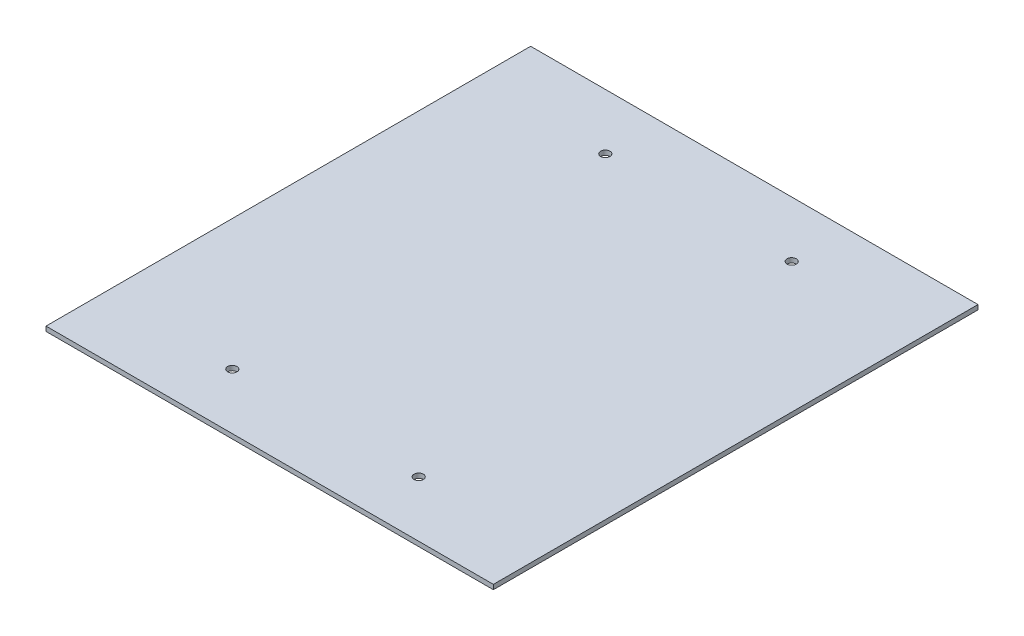
ISO-10303-21;
HEADER;
FILE_DESCRIPTION(('STEP AP214'),'2;1');
FILE_NAME('part.step','',(''),(''),'','','');
FILE_SCHEMA(('AUTOMOTIVE_DESIGN { 1 0 10303 214 1 1 1 1 }'));
ENDSEC;
DATA;
#1=APPLICATION_CONTEXT('core data for automotive mechanical design processes');
#2=APPLICATION_PROTOCOL_DEFINITION('international standard','automotive_design',2000,#1);
#3=PRODUCT_CONTEXT('',#1,'mechanical');
#4=PRODUCT('Part','Part','',(#3));
#5=PRODUCT_RELATED_PRODUCT_CATEGORY('part','',(#4));
#6=PRODUCT_DEFINITION_FORMATION('','',#4);
#7=PRODUCT_DEFINITION_CONTEXT('part definition',#1,'design');
#8=PRODUCT_DEFINITION('design','',#6,#7);
#9=PRODUCT_DEFINITION_SHAPE('','',#8);
#10=(LENGTH_UNIT() NAMED_UNIT(*) SI_UNIT(.MILLI.,.METRE.));
#11=(NAMED_UNIT(*) PLANE_ANGLE_UNIT() SI_UNIT($,.RADIAN.));
#12=(NAMED_UNIT(*) SI_UNIT($,.STERADIAN.) SOLID_ANGLE_UNIT());
#13=UNCERTAINTY_MEASURE_WITH_UNIT(LENGTH_MEASURE(1.E-05),#10,'distance_accuracy_value','');
#14=(GEOMETRIC_REPRESENTATION_CONTEXT(3) GLOBAL_UNCERTAINTY_ASSIGNED_CONTEXT((#13)) GLOBAL_UNIT_ASSIGNED_CONTEXT((#10,
#11,#12)) REPRESENTATION_CONTEXT('',''));
#15=CARTESIAN_POINT('',(0.,0.,0.));
#16=DIRECTION('',(0.,0.,1.));
#17=DIRECTION('',(1.,0.,0.));
#18=AXIS2_PLACEMENT_3D('',#15,#16,#17);
#19=CARTESIAN_POINT('',(152.4,-3.175,165.1));
#20=DIRECTION('',(1.,0.,0.));
#21=DIRECTION('',(0.,0.,-1.));
#22=AXIS2_PLACEMENT_3D('',#19,#20,#21);
#23=PLANE('',#22);
#24=DIRECTION('',(0.,0.,-1.));
#25=VECTOR('',#24,1.);
#26=CARTESIAN_POINT('',(152.4,0.,165.1));
#27=LINE('',#26,#25);
#28=CARTESIAN_POINT('',(152.4,0.,165.1));
#29=VERTEX_POINT('',#28);
#30=CARTESIAN_POINT('',(152.4,0.,-165.1));
#31=VERTEX_POINT('',#30);
#32=EDGE_CURVE('E118',#29,#31,#27,.T.);
#33=ORIENTED_EDGE('',*,*,#32,.F.);
#34=DIRECTION('',(0.,1.,0.));
#35=VECTOR('',#34,1.);
#36=CARTESIAN_POINT('',(152.4,-3.175,165.1));
#37=LINE('',#36,#35);
#38=CARTESIAN_POINT('',(152.4,-3.175,165.1));
#39=VERTEX_POINT('',#38);
#40=EDGE_CURVE('E11',#39,#29,#37,.T.);
#41=ORIENTED_EDGE('',*,*,#40,.F.);
#42=DIRECTION('',(0.,0.,-1.));
#43=VECTOR('',#42,1.);
#44=CARTESIAN_POINT('',(152.4,-3.175,165.1));
#45=LINE('',#44,#43);
#46=CARTESIAN_POINT('',(152.4,-3.175,-165.1));
#47=VERTEX_POINT('',#46);
#48=EDGE_CURVE('E109',#39,#47,#45,.T.);
#49=ORIENTED_EDGE('',*,*,#48,.T.);
#50=DIRECTION('',(0.,1.,0.));
#51=VECTOR('',#50,1.);
#52=CARTESIAN_POINT('',(152.4,-3.175,-165.1));
#53=LINE('',#52,#51);
#54=EDGE_CURVE('E50',#47,#31,#53,.T.);
#55=ORIENTED_EDGE('',*,*,#54,.T.);
#56=EDGE_LOOP('',(#33,#41,#49,#55));
#57=FACE_BOUND('',#56,.T.);
#58=ADVANCED_FACE('F47',(#57),#23,.T.);
#59=CARTESIAN_POINT('',(-152.4,-3.175,165.1));
#60=DIRECTION('',(0.,0.,1.));
#61=DIRECTION('',(1.,0.,0.));
#62=AXIS2_PLACEMENT_3D('',#59,#60,#61);
#63=PLANE('',#62);
#64=DIRECTION('',(1.,0.,0.));
#65=VECTOR('',#64,1.);
#66=CARTESIAN_POINT('',(-152.4,0.,165.1));
#67=LINE('',#66,#65);
#68=CARTESIAN_POINT('',(-152.4,0.,165.1));
#69=VERTEX_POINT('',#68);
#70=EDGE_CURVE('E112',#69,#29,#67,.T.);
#71=ORIENTED_EDGE('',*,*,#70,.F.);
#72=DIRECTION('',(0.,1.,0.));
#73=VECTOR('',#72,1.);
#74=CARTESIAN_POINT('',(-152.4,-3.175,165.1));
#75=LINE('',#74,#73);
#76=CARTESIAN_POINT('',(-152.4,-3.175,165.1));
#77=VERTEX_POINT('',#76);
#78=EDGE_CURVE('E57',#77,#69,#75,.T.);
#79=ORIENTED_EDGE('',*,*,#78,.F.);
#80=DIRECTION('',(1.,0.,0.));
#81=VECTOR('',#80,1.);
#82=CARTESIAN_POINT('',(-152.4,-3.175,165.1));
#83=LINE('',#82,#81);
#84=EDGE_CURVE('E104',#77,#39,#83,.T.);
#85=ORIENTED_EDGE('',*,*,#84,.T.);
#86=ORIENTED_EDGE('',*,*,#40,.T.);
#87=EDGE_LOOP('',(#71,#79,#85,#86));
#88=FACE_BOUND('',#87,.T.);
#89=ADVANCED_FACE('F135',(#88),#63,.T.);
#90=CARTESIAN_POINT('',(-152.4,-3.175,165.1));
#91=DIRECTION('',(-1.,0.,0.));
#92=DIRECTION('',(0.,0.,1.));
#93=AXIS2_PLACEMENT_3D('',#90,#91,#92);
#94=PLANE('',#93);
#95=DIRECTION('',(0.,0.,1.));
#96=VECTOR('',#95,1.);
#97=CARTESIAN_POINT('',(-152.4,0.,165.1));
#98=LINE('',#97,#96);
#99=CARTESIAN_POINT('',(-152.4,0.,-165.1));
#100=VERTEX_POINT('',#99);
#101=EDGE_CURVE('E98',#100,#69,#98,.T.);
#102=ORIENTED_EDGE('',*,*,#101,.F.);
#103=DIRECTION('',(0.,1.,0.));
#104=VECTOR('',#103,1.);
#105=CARTESIAN_POINT('',(-152.4,-3.175,-165.1));
#106=LINE('',#105,#104);
#107=CARTESIAN_POINT('',(-152.4,-3.175,-165.1));
#108=VERTEX_POINT('',#107);
#109=EDGE_CURVE('E93',#108,#100,#106,.T.);
#110=ORIENTED_EDGE('',*,*,#109,.F.);
#111=DIRECTION('',(0.,0.,1.));
#112=VECTOR('',#111,1.);
#113=CARTESIAN_POINT('',(-152.4,-3.175,165.1));
#114=LINE('',#113,#112);
#115=EDGE_CURVE('E96',#108,#77,#114,.T.);
#116=ORIENTED_EDGE('',*,*,#115,.T.);
#117=ORIENTED_EDGE('',*,*,#78,.T.);
#118=EDGE_LOOP('',(#102,#110,#116,#117));
#119=FACE_BOUND('',#118,.T.);
#120=ADVANCED_FACE('F95',(#119),#94,.T.);
#121=CARTESIAN_POINT('',(-152.4,-3.175,-165.1));
#122=DIRECTION('',(0.,0.,-1.));
#123=DIRECTION('',(-1.,0.,0.));
#124=AXIS2_PLACEMENT_3D('',#121,#122,#123);
#125=PLANE('',#124);
#126=DIRECTION('',(-1.,0.,0.));
#127=VECTOR('',#126,1.);
#128=CARTESIAN_POINT('',(-152.4,0.,-165.1));
#129=LINE('',#128,#127);
#130=EDGE_CURVE('E122',#31,#100,#129,.T.);
#131=ORIENTED_EDGE('',*,*,#130,.F.);
#132=ORIENTED_EDGE('',*,*,#54,.F.);
#133=DIRECTION('',(-1.,0.,0.));
#134=VECTOR('',#133,1.);
#135=CARTESIAN_POINT('',(-152.4,-3.175,-165.1));
#136=LINE('',#135,#134);
#137=EDGE_CURVE('E103',#47,#108,#136,.T.);
#138=ORIENTED_EDGE('',*,*,#137,.T.);
#139=ORIENTED_EDGE('',*,*,#109,.T.);
#140=EDGE_LOOP('',(#131,#132,#138,#139));
#141=FACE_BOUND('',#140,.T.);
#142=ADVANCED_FACE('F107',(#141),#125,.T.);
#143=CARTESIAN_POINT('',(0.,-3.175,0.));
#144=DIRECTION('',(0.,-1.,0.));
#145=DIRECTION('',(0.,0.,-1.));
#146=AXIS2_PLACEMENT_3D('',#143,#144,#145);
#147=PLANE('',#146);
#148=CARTESIAN_POINT('',(-63.5,-3.175,127.06));
#149=DIRECTION('',(0.,1.,0.));
#150=DIRECTION('',(0.,0.,1.));
#151=AXIS2_PLACEMENT_3D('',#148,#149,#150);
#152=CIRCLE('',#151,3.175);
#153=CARTESIAN_POINT('',(-63.5,-3.175,130.235));
#154=VERTEX_POINT('',#153);
#155=EDGE_CURVE('E202',#154,#154,#152,.T.);
#156=ORIENTED_EDGE('',*,*,#155,.T.);
#157=EDGE_LOOP('',(#156));
#158=FACE_BOUND('',#157,.T.);
#159=CARTESIAN_POINT('',(63.5,-3.175,127.06));
#160=DIRECTION('',(0.,1.,0.));
#161=DIRECTION('',(0.,0.,1.));
#162=AXIS2_PLACEMENT_3D('',#159,#160,#161);
#163=CIRCLE('',#162,3.175);
#164=CARTESIAN_POINT('',(63.5,-3.175,130.235));
#165=VERTEX_POINT('',#164);
#166=EDGE_CURVE('E194',#165,#165,#163,.T.);
#167=ORIENTED_EDGE('',*,*,#166,.T.);
#168=EDGE_LOOP('',(#167));
#169=FACE_BOUND('',#168,.T.);
#170=CARTESIAN_POINT('',(63.5,-3.175,-127.06));
#171=DIRECTION('',(0.,1.,0.));
#172=DIRECTION('',(0.,0.,1.));
#173=AXIS2_PLACEMENT_3D('',#170,#171,#172);
#174=CIRCLE('',#173,3.175);
#175=CARTESIAN_POINT('',(63.5,-3.175,-123.885));
#176=VERTEX_POINT('',#175);
#177=EDGE_CURVE('E177',#176,#176,#174,.T.);
#178=ORIENTED_EDGE('',*,*,#177,.T.);
#179=EDGE_LOOP('',(#178));
#180=FACE_BOUND('',#179,.T.);
#181=CARTESIAN_POINT('',(-63.5,-3.175,-127.06));
#182=DIRECTION('',(0.,1.,0.));
#183=DIRECTION('',(0.,0.,1.));
#184=AXIS2_PLACEMENT_3D('',#181,#182,#183);
#185=CIRCLE('',#184,3.175);
#186=CARTESIAN_POINT('',(-63.5,-3.175,-123.885));
#187=VERTEX_POINT('',#186);
#188=EDGE_CURVE('E123',#187,#187,#185,.T.);
#189=ORIENTED_EDGE('',*,*,#188,.T.);
#190=EDGE_LOOP('',(#189));
#191=FACE_BOUND('',#190,.T.);
#192=ORIENTED_EDGE('',*,*,#48,.F.);
#193=ORIENTED_EDGE('',*,*,#84,.F.);
#194=ORIENTED_EDGE('',*,*,#115,.F.);
#195=ORIENTED_EDGE('',*,*,#137,.F.);
#196=EDGE_LOOP('',(#192,#193,#194,#195));
#197=FACE_BOUND('',#196,.T.);
#198=ADVANCED_FACE('F102',(#158,#169,#180,#191,#197),#147,.T.);
#199=CARTESIAN_POINT('',(0.,0.,0.));
#200=DIRECTION('',(0.,-1.,0.));
#201=DIRECTION('',(0.,0.,-1.));
#202=AXIS2_PLACEMENT_3D('',#199,#200,#201);
#203=PLANE('',#202);
#204=CARTESIAN_POINT('',(-63.5,0.,127.06));
#205=DIRECTION('',(0.,1.,0.));
#206=DIRECTION('',(0.,0.,1.));
#207=AXIS2_PLACEMENT_3D('',#204,#205,#206);
#208=CIRCLE('',#207,3.175);
#209=CARTESIAN_POINT('',(-63.5,0.,130.235));
#210=VERTEX_POINT('',#209);
#211=EDGE_CURVE('E198',#210,#210,#208,.T.);
#212=ORIENTED_EDGE('',*,*,#211,.F.);
#213=EDGE_LOOP('',(#212));
#214=FACE_BOUND('',#213,.T.);
#215=CARTESIAN_POINT('',(63.5,0.,127.06));
#216=DIRECTION('',(0.,1.,0.));
#217=DIRECTION('',(0.,0.,1.));
#218=AXIS2_PLACEMENT_3D('',#215,#216,#217);
#219=CIRCLE('',#218,3.175);
#220=CARTESIAN_POINT('',(63.5,0.,130.235));
#221=VERTEX_POINT('',#220);
#222=EDGE_CURVE('E188',#221,#221,#219,.T.);
#223=ORIENTED_EDGE('',*,*,#222,.F.);
#224=EDGE_LOOP('',(#223));
#225=FACE_BOUND('',#224,.T.);
#226=CARTESIAN_POINT('',(63.5,0.,-127.06));
#227=DIRECTION('',(0.,1.,0.));
#228=DIRECTION('',(0.,0.,1.));
#229=AXIS2_PLACEMENT_3D('',#226,#227,#228);
#230=CIRCLE('',#229,3.175);
#231=CARTESIAN_POINT('',(63.5,0.,-123.885));
#232=VERTEX_POINT('',#231);
#233=EDGE_CURVE('E180',#232,#232,#230,.T.);
#234=ORIENTED_EDGE('',*,*,#233,.F.);
#235=EDGE_LOOP('',(#234));
#236=FACE_BOUND('',#235,.T.);
#237=CARTESIAN_POINT('',(-63.5,0.,-127.06));
#238=DIRECTION('',(0.,1.,0.));
#239=DIRECTION('',(0.,0.,1.));
#240=AXIS2_PLACEMENT_3D('',#237,#238,#239);
#241=CIRCLE('',#240,3.175);
#242=CARTESIAN_POINT('',(-63.5,0.,-123.885));
#243=VERTEX_POINT('',#242);
#244=EDGE_CURVE('E183',#243,#243,#241,.T.);
#245=ORIENTED_EDGE('',*,*,#244,.F.);
#246=EDGE_LOOP('',(#245));
#247=FACE_BOUND('',#246,.T.);
#248=ORIENTED_EDGE('',*,*,#32,.T.);
#249=ORIENTED_EDGE('',*,*,#130,.T.);
#250=ORIENTED_EDGE('',*,*,#101,.T.);
#251=ORIENTED_EDGE('',*,*,#70,.T.);
#252=EDGE_LOOP('',(#248,#249,#250,#251));
#253=FACE_BOUND('',#252,.T.);
#254=ADVANCED_FACE('F134',(#214,#225,#236,#247,#253),#203,.F.);
#255=CARTESIAN_POINT('',(-63.5,-3.175,-127.06));
#256=DIRECTION('',(0.,1.,0.));
#257=DIRECTION('',(0.,0.,1.));
#258=AXIS2_PLACEMENT_3D('',#255,#256,#257);
#259=CYLINDRICAL_SURFACE('',#258,3.175);
#260=ORIENTED_EDGE('',*,*,#188,.F.);
#261=EDGE_LOOP('',(#260));
#262=FACE_BOUND('',#261,.T.);
#263=ORIENTED_EDGE('',*,*,#244,.T.);
#264=EDGE_LOOP('',(#263));
#265=FACE_BOUND('',#264,.T.);
#266=ADVANCED_FACE('F153',(#262,#265),#259,.F.);
#267=CARTESIAN_POINT('',(63.5,-3.175,-127.06));
#268=DIRECTION('',(0.,1.,0.));
#269=DIRECTION('',(0.,0.,1.));
#270=AXIS2_PLACEMENT_3D('',#267,#268,#269);
#271=CYLINDRICAL_SURFACE('',#270,3.175);
#272=ORIENTED_EDGE('',*,*,#177,.F.);
#273=EDGE_LOOP('',(#272));
#274=FACE_BOUND('',#273,.T.);
#275=ORIENTED_EDGE('',*,*,#233,.T.);
#276=EDGE_LOOP('',(#275));
#277=FACE_BOUND('',#276,.T.);
#278=ADVANCED_FACE('F160',(#274,#277),#271,.F.);
#279=CARTESIAN_POINT('',(63.5,-3.175,127.06));
#280=DIRECTION('',(0.,1.,0.));
#281=DIRECTION('',(0.,0.,1.));
#282=AXIS2_PLACEMENT_3D('',#279,#280,#281);
#283=CYLINDRICAL_SURFACE('',#282,3.175);
#284=ORIENTED_EDGE('',*,*,#166,.F.);
#285=EDGE_LOOP('',(#284));
#286=FACE_BOUND('',#285,.T.);
#287=ORIENTED_EDGE('',*,*,#222,.T.);
#288=EDGE_LOOP('',(#287));
#289=FACE_BOUND('',#288,.T.);
#290=ADVANCED_FACE('F165',(#286,#289),#283,.F.);
#291=CARTESIAN_POINT('',(-63.5,-3.175,127.06));
#292=DIRECTION('',(0.,1.,0.));
#293=DIRECTION('',(0.,0.,1.));
#294=AXIS2_PLACEMENT_3D('',#291,#292,#293);
#295=CYLINDRICAL_SURFACE('',#294,3.175);
#296=ORIENTED_EDGE('',*,*,#155,.F.);
#297=EDGE_LOOP('',(#296));
#298=FACE_BOUND('',#297,.T.);
#299=ORIENTED_EDGE('',*,*,#211,.T.);
#300=EDGE_LOOP('',(#299));
#301=FACE_BOUND('',#300,.T.);
#302=ADVANCED_FACE('F162',(#298,#301),#295,.F.);
#303=CLOSED_SHELL('',(#58,#89,#120,#142,#198,#254,#266,#278,#290,#302));
#304=MANIFOLD_SOLID_BREP('B2',#303);
#305=ADVANCED_BREP_SHAPE_REPRESENTATION('',(#18,#304),#14);
#306=SHAPE_DEFINITION_REPRESENTATION(#9,#305);
ENDSEC;
END-ISO-10303-21;
